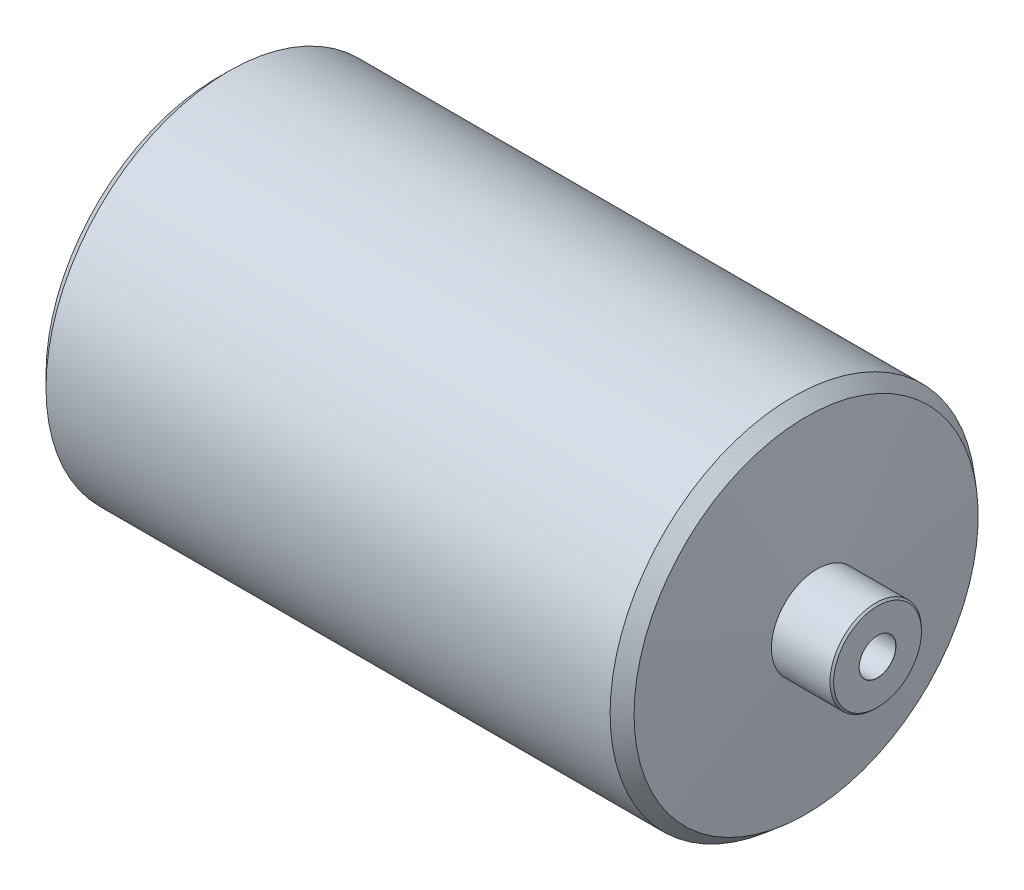
ISO-10303-21;
HEADER;
FILE_DESCRIPTION(('STEP AP214'),'2;1');
FILE_NAME('part.step','',(''),(''),'','','');
FILE_SCHEMA(('AUTOMOTIVE_DESIGN { 1 0 10303 214 1 1 1 1 }'));
ENDSEC;
DATA;
#1=APPLICATION_CONTEXT('core data for automotive mechanical design processes');
#2=APPLICATION_PROTOCOL_DEFINITION('international standard','automotive_design',2000,#1);
#3=PRODUCT_CONTEXT('',#1,'mechanical');
#4=PRODUCT('Part','Part','',(#3));
#5=PRODUCT_RELATED_PRODUCT_CATEGORY('part','',(#4));
#6=PRODUCT_DEFINITION_FORMATION('','',#4);
#7=PRODUCT_DEFINITION_CONTEXT('part definition',#1,'design');
#8=PRODUCT_DEFINITION('design','',#6,#7);
#9=PRODUCT_DEFINITION_SHAPE('','',#8);
#10=(LENGTH_UNIT() NAMED_UNIT(*) SI_UNIT(.MILLI.,.METRE.));
#11=(NAMED_UNIT(*) PLANE_ANGLE_UNIT() SI_UNIT($,.RADIAN.));
#12=(NAMED_UNIT(*) SI_UNIT($,.STERADIAN.) SOLID_ANGLE_UNIT());
#13=UNCERTAINTY_MEASURE_WITH_UNIT(LENGTH_MEASURE(1.E-05),#10,'distance_accuracy_value','');
#14=(GEOMETRIC_REPRESENTATION_CONTEXT(3) GLOBAL_UNCERTAINTY_ASSIGNED_CONTEXT((#13)) GLOBAL_UNIT_ASSIGNED_CONTEXT((#10,
#11,#12)) REPRESENTATION_CONTEXT('',''));
#15=CARTESIAN_POINT('',(0.,0.,0.));
#16=DIRECTION('',(0.,0.,1.));
#17=DIRECTION('',(1.,0.,0.));
#18=AXIS2_PLACEMENT_3D('',#15,#16,#17);
#19=CARTESIAN_POINT('',(100.,0.,0.));
#20=DIRECTION('',(-1.,0.,0.));
#21=DIRECTION('',(0.,0.,1.));
#22=AXIS2_PLACEMENT_3D('',#19,#20,#21);
#23=CYLINDRICAL_SURFACE('',#22,50.);
#24=CARTESIAN_POINT('',(-77.219175117778,0.,0.));
#25=DIRECTION('',(1.,0.,0.));
#26=DIRECTION('',(0.,0.,-1.));
#27=AXIS2_PLACEMENT_3D('',#24,#25,#26);
#28=CIRCLE('',#27,50.);
#29=CARTESIAN_POINT('',(-77.219175117778,0.,-50.));
#30=VERTEX_POINT('',#29);
#31=EDGE_CURVE('E11',#30,#30,#28,.T.);
#32=ORIENTED_EDGE('',*,*,#31,.T.);
#33=EDGE_LOOP('',(#32));
#34=FACE_BOUND('',#33,.T.);
#35=CARTESIAN_POINT('',(76.9189865148985,0.,0.));
#36=DIRECTION('',(-1.,0.,0.));
#37=DIRECTION('',(0.,0.,1.));
#38=AXIS2_PLACEMENT_3D('',#35,#36,#37);
#39=CIRCLE('',#38,50.);
#40=CARTESIAN_POINT('',(76.9189865148985,0.,50.));
#41=VERTEX_POINT('',#40);
#42=EDGE_CURVE('E103',#41,#41,#39,.T.);
#43=ORIENTED_EDGE('',*,*,#42,.T.);
#44=EDGE_LOOP('',(#43));
#45=FACE_BOUND('',#44,.T.);
#46=ADVANCED_FACE('F45',(#34,#45),#23,.T.);
#47=CARTESIAN_POINT('',(83.5,0.,0.));
#48=DIRECTION('',(1.,0.,0.));
#49=DIRECTION('',(0.,0.,-1.));
#50=AXIS2_PLACEMENT_3D('',#47,#48,#49);
#51=CYLINDRICAL_SURFACE('',#50,12.5);
#52=CARTESIAN_POINT('',(99.5,0.,0.));
#53=DIRECTION('',(1.,0.,0.));
#54=DIRECTION('',(0.,0.,-1.));
#55=AXIS2_PLACEMENT_3D('',#52,#53,#54);
#56=CIRCLE('',#55,12.5);
#57=CARTESIAN_POINT('',(99.5,0.,-12.5));
#58=VERTEX_POINT('',#57);
#59=EDGE_CURVE('E100',#58,#58,#56,.F.);
#60=ORIENTED_EDGE('',*,*,#59,.T.);
#61=EDGE_LOOP('',(#60));
#62=FACE_BOUND('',#61,.T.);
#63=CARTESIAN_POINT('',(83.5,0.,0.));
#64=DIRECTION('',(-1.,0.,0.));
#65=DIRECTION('',(0.,0.,1.));
#66=AXIS2_PLACEMENT_3D('',#63,#64,#65);
#67=CIRCLE('',#66,12.5);
#68=CARTESIAN_POINT('',(83.5,0.,12.4999999999999));
#69=VERTEX_POINT('',#68);
#70=EDGE_CURVE('E94',#69,#69,#67,.T.);
#71=ORIENTED_EDGE('',*,*,#70,.F.);
#72=EDGE_LOOP('',(#71));
#73=FACE_BOUND('',#72,.T.);
#74=ADVANCED_FACE('F131',(#62,#73),#51,.T.);
#75=CARTESIAN_POINT('',(100.,0.,0.));
#76=DIRECTION('',(1.,0.,0.));
#77=DIRECTION('',(0.,0.,-1.));
#78=AXIS2_PLACEMENT_3D('',#75,#76,#77);
#79=PLANE('',#78);
#80=CARTESIAN_POINT('',(100.,0.,0.));
#81=DIRECTION('',(1.,0.,0.));
#82=DIRECTION('',(0.,0.,-1.));
#83=AXIS2_PLACEMENT_3D('',#80,#81,#82);
#84=CIRCLE('',#83,5.025);
#85=CARTESIAN_POINT('',(100.,0.,-5.025));
#86=VERTEX_POINT('',#85);
#87=EDGE_CURVE('E73',#86,#86,#84,.T.);
#88=ORIENTED_EDGE('',*,*,#87,.F.);
#89=EDGE_LOOP('',(#88));
#90=FACE_BOUND('',#89,.T.);
#91=CARTESIAN_POINT('',(100.,0.,0.));
#92=DIRECTION('',(1.,0.,0.));
#93=DIRECTION('',(0.,0.,-1.));
#94=AXIS2_PLACEMENT_3D('',#91,#92,#93);
#95=CIRCLE('',#94,12.);
#96=CARTESIAN_POINT('',(100.,0.,-12.));
#97=VERTEX_POINT('',#96);
#98=EDGE_CURVE('E97',#97,#97,#95,.T.);
#99=ORIENTED_EDGE('',*,*,#98,.T.);
#100=EDGE_LOOP('',(#99));
#101=FACE_BOUND('',#100,.T.);
#102=ADVANCED_FACE('F139',(#90,#101),#79,.T.);
#103=CARTESIAN_POINT('',(100.,0.,0.));
#104=DIRECTION('',(-1.,0.,0.));
#105=DIRECTION('',(0.,0.,1.));
#106=AXIS2_PLACEMENT_3D('',#103,#104,#105);
#107=CONICAL_SURFACE('',#106,12.,0.785398163397424);
#108=ORIENTED_EDGE('',*,*,#59,.F.);
#109=EDGE_LOOP('',(#108));
#110=FACE_BOUND('',#109,.T.);
#111=ORIENTED_EDGE('',*,*,#98,.F.);
#112=EDGE_LOOP('',(#111));
#113=FACE_BOUND('',#112,.T.);
#114=ADVANCED_FACE('F146',(#110,#113),#107,.T.);
#115=CARTESIAN_POINT('',(83.5,0.,0.));
#116=DIRECTION('',(-1.,0.,0.));
#117=DIRECTION('',(0.,0.,1.));
#118=AXIS2_PLACEMENT_3D('',#115,#116,#117);
#119=CONICAL_SURFACE('',#118,12.5,1.48352986419518);
#120=CARTESIAN_POINT('',(80.480642346021,0.,0.));
#121=DIRECTION('',(1.,0.,0.));
#122=DIRECTION('',(0.,0.,-1.));
#123=AXIS2_PLACEMENT_3D('',#120,#121,#122);
#124=CIRCLE('',#123,47.0114159057248);
#125=CARTESIAN_POINT('',(80.480642346021,0.,47.0114159057249));
#126=VERTEX_POINT('',#125);
#127=EDGE_CURVE('E106',#126,#126,#124,.T.);
#128=CARTESIAN_POINT('',(80.480642346021,0.,47.0114159057249));
#129=CARTESIAN_POINT('',(80.5120939882499,0.,46.6519219900403));
#130=CARTESIAN_POINT('',(80.5435456304788,0.,46.2924280743557));
#131=CARTESIAN_POINT('',(80.6064489149367,0.,45.5734402429864));
#132=CARTESIAN_POINT('',(80.6379005571657,0.,45.2139463273018));
#133=CARTESIAN_POINT('',(80.7008038416236,0.,44.4949584959325));
#134=CARTESIAN_POINT('',(80.7322554838525,0.,44.1354645802479));
#135=CARTESIAN_POINT('',(80.7951587683104,0.,43.4164767488786));
#136=CARTESIAN_POINT('',(80.8266104105394,0.,43.0569828331939));
#137=CARTESIAN_POINT('',(80.8895136949973,0.,42.3379950018247));
#138=CARTESIAN_POINT('',(80.9209653372262,0.,41.97850108614));
#139=CARTESIAN_POINT('',(80.9838686216841,0.,41.2595132547708));
#140=CARTESIAN_POINT('',(81.0153202639131,0.,40.9000193390861));
#141=CARTESIAN_POINT('',(81.078223548371,0.,40.1810315077169));
#142=CARTESIAN_POINT('',(81.1096751905999,0.,39.8215375920322));
#143=CARTESIAN_POINT('',(81.1725784750578,0.,39.102549760663));
#144=CARTESIAN_POINT('',(81.2040301172868,0.,38.7430558449783));
#145=CARTESIAN_POINT('',(81.2669334017447,0.,38.0240680136091));
#146=CARTESIAN_POINT('',(81.2983850439736,0.,37.6645740979244));
#147=CARTESIAN_POINT('',(81.3612883284315,0.,36.9455862665551));
#148=CARTESIAN_POINT('',(81.3927399706604,0.,36.5860923508705));
#149=CARTESIAN_POINT('',(81.4556432551183,0.,35.8671045195012));
#150=CARTESIAN_POINT('',(81.4870948973473,0.,35.5076106038166));
#151=CARTESIAN_POINT('',(81.5499981818052,0.,34.7886227724473));
#152=CARTESIAN_POINT('',(81.5814498240342,0.,34.4291288567627));
#153=CARTESIAN_POINT('',(81.6443531084921,0.,33.7101410253934));
#154=CARTESIAN_POINT('',(81.675804750721,0.,33.3506471097088));
#155=CARTESIAN_POINT('',(81.7387080351789,0.,32.6316592783395));
#156=CARTESIAN_POINT('',(81.7701596774078,0.,32.2721653626549));
#157=CARTESIAN_POINT('',(81.8330629618657,0.,31.5531775312856));
#158=CARTESIAN_POINT('',(81.8645146040947,0.,31.193683615601));
#159=CARTESIAN_POINT('',(81.9274178885526,0.,30.4746957842317));
#160=CARTESIAN_POINT('',(81.9588695307815,0.,30.1152018685471));
#161=CARTESIAN_POINT('',(82.0217728152394,0.,29.3962140371778));
#162=CARTESIAN_POINT('',(82.0532244574684,0.,29.0367201214932));
#163=CARTESIAN_POINT('',(82.1161277419263,0.,28.3177322901239));
#164=CARTESIAN_POINT('',(82.1475793841552,0.,27.9582383744393));
#165=CARTESIAN_POINT('',(82.2104826686131,0.,27.23925054307));
#166=CARTESIAN_POINT('',(82.2419343108421,0.,26.8797566273853));
#167=CARTESIAN_POINT('',(82.3048375953,0.,26.1607687960161));
#168=CARTESIAN_POINT('',(82.3362892375289,0.,25.8012748803314));
#169=CARTESIAN_POINT('',(82.3991925219868,0.,25.0822870489622));
#170=CARTESIAN_POINT('',(82.4306441642157,0.,24.7227931332775));
#171=CARTESIAN_POINT('',(82.4935474486737,0.,24.0038053019083));
#172=CARTESIAN_POINT('',(82.5249990909026,0.,23.6443113862236));
#173=CARTESIAN_POINT('',(82.5879023753605,0.,22.9253235548544));
#174=CARTESIAN_POINT('',(82.6193540175894,0.,22.5658296391697));
#175=CARTESIAN_POINT('',(82.6822573020474,0.,21.8468418078005));
#176=CARTESIAN_POINT('',(82.7137089442763,0.,21.4873478921158));
#177=CARTESIAN_POINT('',(82.7766122287342,0.,20.7683600607465));
#178=CARTESIAN_POINT('',(82.8080638709631,0.,20.4088661450619));
#179=CARTESIAN_POINT('',(82.870967155421,0.,19.6898783136926));
#180=CARTESIAN_POINT('',(82.90241879765,0.,19.330384398008));
#181=CARTESIAN_POINT('',(82.9653220821079,0.,18.6113965666387));
#182=CARTESIAN_POINT('',(82.9967737243368,0.,18.2519026509541));
#183=CARTESIAN_POINT('',(83.0596770087947,0.,17.5329148195848));
#184=CARTESIAN_POINT('',(83.0911286510237,0.,17.1734209039002));
#185=CARTESIAN_POINT('',(83.1540319354816,0.,16.4544330725309));
#186=CARTESIAN_POINT('',(83.1854835777105,0.,16.0949391568463));
#187=CARTESIAN_POINT('',(83.2483868621684,0.,15.375951325477));
#188=CARTESIAN_POINT('',(83.2798385043974,0.,15.0164574097924));
#189=CARTESIAN_POINT('',(83.3427417888553,0.,14.2974695784231));
#190=CARTESIAN_POINT('',(83.3741934310842,0.,13.9379756627385));
#191=CARTESIAN_POINT('',(83.4370967155421,0.,13.2189878313692));
#192=CARTESIAN_POINT('',(83.4685483577711,0.,12.8594939156846));
#193=CARTESIAN_POINT('',(83.5,0.,12.4999999999999));
#194=B_SPLINE_CURVE_WITH_KNOTS('',3,(#128,#129,#130,#131,#132,#133,#134,#135,#136,#137,#138,
#139,#140,#141,#142,#143,#144,#145,#146,#147,#148,#149,#150,#151,#152,#153,#154,#155,#156,#157,
#158,#159,#160,#161,#162,#163,#164,#165,#166,#167,#168,#169,#170,#171,#172,#173,#174,#175,#176,
#177,#178,#179,#180,#181,#182,#183,#184,#185,#186,#187,#188,#189,#190,#191,#192,#193),
.UNSPECIFIED.,.F.,.F.,(4,2,2,2,2,2,2,2,2,2,2,2,2,2,2,2,2,2,2,2,2,2,2,2,2,2,2,2,2,2,2,2,4),(0.,
1.08260137212111,2.16520274424223,3.24780411636335,4.33040548848447,5.41300686060558,
6.4956082327267,7.57820960484783,8.66081097696894,9.74341234909006,10.8260137212112,
11.9086150933323,12.9912164654534,14.0738178375745,15.1564192096956,16.2390205818168,
17.3216219539379,18.404223326059,19.4868246981801,20.5694260703012,21.6520274424224,
22.7346288145435,23.8172301866646,24.8998315587857,25.9824329309068,27.0650343030279,
28.1476356751491,29.2302370472702,30.3128384193913,31.3954397915124,32.4780411636335,
33.5606425357547,34.6432439078758),.UNSPECIFIED.);
#195=EDGE_CURVE('BSEAM152',#126,#69,#194,.T.);
#196=ORIENTED_EDGE('',*,*,#127,.T.);
#197=ORIENTED_EDGE('',*,*,#70,.T.);
#198=ORIENTED_EDGE('',*,*,#195,.T.);
#199=ORIENTED_EDGE('',*,*,#195,.F.);
#200=EDGE_LOOP('',(#196,#198,#197,#199));
#201=FACE_BOUND('',#200,.T.);
#202=ADVANCED_FACE('F152',(#201),#119,.T.);
#203=CARTESIAN_POINT('',(76.9189865148985,0.,0.));
#204=DIRECTION('',(-1.,0.,0.));
#205=DIRECTION('',(0.,0.,1.));
#206=AXIS2_PLACEMENT_3D('',#203,#204,#205);
#207=CONICAL_SURFACE('',#206,50.,0.698131700797732);
#208=CARTESIAN_POINT('',(80.4806423460209,0.,47.0114159057248));
#209=CARTESIAN_POINT('',(80.4435417644467,0.,47.0425469900402));
#210=CARTESIAN_POINT('',(80.4064411828726,0.,47.0736780743555));
#211=CARTESIAN_POINT('',(80.3322400197242,0.,47.1359402429863));
#212=CARTESIAN_POINT('',(80.29513943815,0.,47.1670713273016));
#213=CARTESIAN_POINT('',(80.2209382750016,0.,47.2293334959324));
#214=CARTESIAN_POINT('',(80.1838376934274,0.,47.2604645802477));
#215=CARTESIAN_POINT('',(80.109636530279,0.,47.3227267488785));
#216=CARTESIAN_POINT('',(80.0725359487048,0.,47.3538578331938));
#217=CARTESIAN_POINT('',(79.9983347855565,0.,47.4161200018246));
#218=CARTESIAN_POINT('',(79.9612342039823,0.,47.4472510861399));
#219=CARTESIAN_POINT('',(79.8870330408339,0.,47.5095132547707));
#220=CARTESIAN_POINT('',(79.8499324592597,0.,47.540644339086));
#221=CARTESIAN_POINT('',(79.7757312961113,0.,47.6029065077168));
#222=CARTESIAN_POINT('',(79.7386307145371,0.,47.6340375920321));
#223=CARTESIAN_POINT('',(79.6644295513887,0.,47.6962997606629));
#224=CARTESIAN_POINT('',(79.6273289698145,0.,47.7274308449782));
#225=CARTESIAN_POINT('',(79.5531278066662,0.,47.789693013609));
#226=CARTESIAN_POINT('',(79.516027225092,0.,47.8208240979243));
#227=CARTESIAN_POINT('',(79.4418260619436,0.,47.8830862665551));
#228=CARTESIAN_POINT('',(79.4047254803694,0.,47.9142173508704));
#229=CARTESIAN_POINT('',(79.330524317221,0.,47.9764795195012));
#230=CARTESIAN_POINT('',(79.2934237356468,0.,48.0076106038165));
#231=CARTESIAN_POINT('',(79.2192225724984,0.,48.0698727724473));
#232=CARTESIAN_POINT('',(79.1821219909242,0.,48.1010038567626));
#233=CARTESIAN_POINT('',(79.1079208277759,0.,48.1632660253934));
#234=CARTESIAN_POINT('',(79.0708202462017,0.,48.1943971097087));
#235=CARTESIAN_POINT('',(78.9966190830533,0.,48.2566592783395));
#236=CARTESIAN_POINT('',(78.9595185014791,0.,48.2877903626548));
#237=CARTESIAN_POINT('',(78.8853173383307,0.,48.3500525312856));
#238=CARTESIAN_POINT('',(78.8482167567565,0.,48.3811836156009));
#239=CARTESIAN_POINT('',(78.7740155936081,0.,48.4434457842317));
#240=CARTESIAN_POINT('',(78.7369150120339,0.,48.474576868547));
#241=CARTESIAN_POINT('',(78.6627138488856,0.,48.5368390371778));
#242=CARTESIAN_POINT('',(78.6256132673114,0.,48.5679701214931));
#243=CARTESIAN_POINT('',(78.551412104163,0.,48.6302322901239));
#244=CARTESIAN_POINT('',(78.5143115225888,0.,48.6613633744392));
#245=CARTESIAN_POINT('',(78.4401103594404,0.,48.72362554307));
#246=CARTESIAN_POINT('',(78.4030097778662,0.,48.7547566273853));
#247=CARTESIAN_POINT('',(78.3288086147178,0.,48.8170187960161));
#248=CARTESIAN_POINT('',(78.2917080331436,0.,48.8481498803314));
#249=CARTESIAN_POINT('',(78.2175068699953,0.,48.9104120489622));
#250=CARTESIAN_POINT('',(78.1804062884211,0.,48.9415431332775));
#251=CARTESIAN_POINT('',(78.1062051252727,0.,49.0038053019083));
#252=CARTESIAN_POINT('',(78.0691045436985,0.,49.0349363862236));
#253=CARTESIAN_POINT('',(77.9949033805501,0.,49.0971985548544));
#254=CARTESIAN_POINT('',(77.9578027989759,0.,49.1283296391697));
#255=CARTESIAN_POINT('',(77.8836016358275,0.,49.1905918078005));
#256=CARTESIAN_POINT('',(77.8465010542533,0.,49.2217228921158));
#257=CARTESIAN_POINT('',(77.772299891105,0.,49.2839850607466));
#258=CARTESIAN_POINT('',(77.7351993095308,0.,49.3151161450619));
#259=CARTESIAN_POINT('',(77.6609981463824,0.,49.3773783136927));
#260=CARTESIAN_POINT('',(77.6238975648082,0.,49.408509398008));
#261=CARTESIAN_POINT('',(77.5496964016598,0.,49.4707715666388));
#262=CARTESIAN_POINT('',(77.5125958200856,0.,49.5019026509541));
#263=CARTESIAN_POINT('',(77.4383946569372,0.,49.5641648195849));
#264=CARTESIAN_POINT('',(77.401294075363,0.,49.5952959039002));
#265=CARTESIAN_POINT('',(77.3270929122147,0.,49.657558072531));
#266=CARTESIAN_POINT('',(77.2899923306405,0.,49.6886891568463));
#267=CARTESIAN_POINT('',(77.2157911674921,0.,49.7509513254771));
#268=CARTESIAN_POINT('',(77.1786905859179,0.,49.7820824097924));
#269=CARTESIAN_POINT('',(77.1044894227695,0.,49.8443445784232));
#270=CARTESIAN_POINT('',(77.0673888411953,0.,49.8754756627385));
#271=CARTESIAN_POINT('',(76.9931876780469,0.,49.9377378313693));
#272=CARTESIAN_POINT('',(76.9560870964728,0.,49.9688689156846));
#273=CARTESIAN_POINT('',(76.9189865148985,0.,50.));
#274=B_SPLINE_CURVE_WITH_KNOTS('',3,(#208,#209,#210,#211,#212,#213,#214,#215,#216,#217,#218,
#219,#220,#221,#222,#223,#224,#225,#226,#227,#228,#229,#230,#231,#232,#233,#234,#235,#236,#237,
#238,#239,#240,#241,#242,#243,#244,#245,#246,#247,#248,#249,#250,#251,#252,#253,#254,#255,#256,
#257,#258,#259,#260,#261,#262,#263,#264,#265,#266,#267,#268,#269,#270,#271,#272,#273),
.UNSPECIFIED.,.F.,.F.,(4,2,2,2,2,2,2,2,2,2,2,2,2,2,2,2,2,2,2,2,2,2,2,2,2,2,2,2,2,2,2,2,4),(0.,
0.145294108876245,0.290588217752489,0.435882326628744,0.581176435504989,0.726470544381238,
0.871764653257493,1.01705876213374,1.16235287100999,1.30764697988624,1.45294108876249,
1.59823519763874,1.74352930651499,1.88882341539123,2.03411752426749,2.17941163314373,
2.32470574201999,2.46999985089623,2.61529395977248,2.76058806864873,2.90588217752498,
3.05117628640123,3.19647039527748,3.34176450415373,3.48705861302999,3.63235272190623,
3.77764683078248,3.92294093965873,4.06823504853498,4.21352915741123,4.35882326628748,
4.50411737516372,4.64941148403998),.UNSPECIFIED.);
#275=EDGE_CURVE('BSEAM154',#126,#41,#274,.T.);
#276=ORIENTED_EDGE('',*,*,#127,.F.);
#277=ORIENTED_EDGE('',*,*,#42,.F.);
#278=ORIENTED_EDGE('',*,*,#275,.T.);
#279=ORIENTED_EDGE('',*,*,#275,.F.);
#280=EDGE_LOOP('',(#276,#278,#277,#279));
#281=FACE_BOUND('',#280,.T.);
#282=ADVANCED_FACE('F154',(#281),#207,.T.);
#283=CARTESIAN_POINT('',(43.5536576308671,0.,0.));
#284=DIRECTION('',(1.,0.,0.));
#285=DIRECTION('',(0.,0.,-1.));
#286=AXIS2_PLACEMENT_3D('',#283,#284,#285);
#287=CONICAL_SURFACE('',#286,4.24999999999999,1.02974425867665);
#288=CARTESIAN_POINT('',(41.,0.,0.));
#289=VERTEX_POINT('',#288);
#290=VERTEX_LOOP('',#289);
#291=FACE_BOUND('',#290,.T.);
#292=CARTESIAN_POINT('',(43.5536576308671,0.,0.));
#293=DIRECTION('',(1.,0.,0.));
#294=DIRECTION('',(0.,0.,-1.));
#295=AXIS2_PLACEMENT_3D('',#292,#293,#294);
#296=CIRCLE('',#295,4.24999999999999);
#297=CARTESIAN_POINT('',(43.5536576308671,0.,-4.24999999999999));
#298=VERTEX_POINT('',#297);
#299=EDGE_CURVE('E91',#298,#298,#296,.T.);
#300=ORIENTED_EDGE('',*,*,#299,.T.);
#301=EDGE_LOOP('',(#300));
#302=FACE_BOUND('',#301,.T.);
#303=ADVANCED_FACE('F159',(#291,#302),#287,.F.);
#304=CARTESIAN_POINT('',(100.,0.,0.));
#305=DIRECTION('',(1.,0.,0.));
#306=DIRECTION('',(0.,0.,-1.));
#307=AXIS2_PLACEMENT_3D('',#304,#305,#306);
#308=CYLINDRICAL_SURFACE('',#307,4.24999999999999);
#309=ORIENTED_EDGE('',*,*,#299,.F.);
#310=EDGE_LOOP('',(#309));
#311=FACE_BOUND('',#310,.T.);
#312=CARTESIAN_POINT('',(50.,0.,0.));
#313=DIRECTION('',(1.,0.,0.));
#314=DIRECTION('',(0.,0.,-1.));
#315=AXIS2_PLACEMENT_3D('',#312,#313,#314);
#316=CIRCLE('',#315,4.24999999999999);
#317=CARTESIAN_POINT('',(50.,0.,-4.24999999999999));
#318=VERTEX_POINT('',#317);
#319=EDGE_CURVE('E88',#318,#318,#316,.T.);
#320=ORIENTED_EDGE('',*,*,#319,.T.);
#321=EDGE_LOOP('',(#320));
#322=FACE_BOUND('',#321,.T.);
#323=ADVANCED_FACE('F191',(#311,#322),#308,.F.);
#324=CARTESIAN_POINT('',(50.,4.24999999999999,0.));
#325=DIRECTION('',(-1.,0.,0.));
#326=DIRECTION('',(0.,0.,1.));
#327=AXIS2_PLACEMENT_3D('',#324,#325,#326);
#328=PLANE('',#327);
#329=ORIENTED_EDGE('',*,*,#319,.F.);
#330=EDGE_LOOP('',(#329));
#331=FACE_BOUND('',#330,.T.);
#332=CARTESIAN_POINT('',(50.,0.,0.));
#333=DIRECTION('',(1.,0.,0.));
#334=DIRECTION('',(0.,0.,-1.));
#335=AXIS2_PLACEMENT_3D('',#332,#333,#334);
#336=CIRCLE('',#335,4.99999999999999);
#337=CARTESIAN_POINT('',(50.,0.,-4.99999999999999));
#338=VERTEX_POINT('',#337);
#339=EDGE_CURVE('E85',#338,#338,#336,.T.);
#340=ORIENTED_EDGE('',*,*,#339,.T.);
#341=EDGE_LOOP('',(#340));
#342=FACE_BOUND('',#341,.T.);
#343=ADVANCED_FACE('F187',(#331,#342),#328,.F.);
#344=CARTESIAN_POINT('',(100.,0.,0.));
#345=DIRECTION('',(1.,0.,0.));
#346=DIRECTION('',(0.,0.,-1.));
#347=AXIS2_PLACEMENT_3D('',#344,#345,#346);
#348=CYLINDRICAL_SURFACE('',#347,4.99999999999999);
#349=ORIENTED_EDGE('',*,*,#339,.F.);
#350=EDGE_LOOP('',(#349));
#351=FACE_BOUND('',#350,.T.);
#352=CARTESIAN_POINT('',(99.975,0.,0.));
#353=DIRECTION('',(1.,0.,0.));
#354=DIRECTION('',(0.,0.,-1.));
#355=AXIS2_PLACEMENT_3D('',#352,#353,#354);
#356=CIRCLE('',#355,4.99999999999999);
#357=CARTESIAN_POINT('',(99.975,0.,-4.99999999999999));
#358=VERTEX_POINT('',#357);
#359=EDGE_CURVE('E82',#358,#358,#356,.T.);
#360=ORIENTED_EDGE('',*,*,#359,.T.);
#361=EDGE_LOOP('',(#360));
#362=FACE_BOUND('',#361,.T.);
#363=ADVANCED_FACE('F180',(#351,#362),#348,.F.);
#364=CARTESIAN_POINT('',(100.,0.,0.));
#365=DIRECTION('',(1.,0.,0.));
#366=DIRECTION('',(0.,0.,-1.));
#367=AXIS2_PLACEMENT_3D('',#364,#365,#366);
#368=CONICAL_SURFACE('',#367,5.025,0.785398163397639);
#369=ORIENTED_EDGE('',*,*,#359,.F.);
#370=EDGE_LOOP('',(#369));
#371=FACE_BOUND('',#370,.T.);
#372=ORIENTED_EDGE('',*,*,#87,.T.);
#373=EDGE_LOOP('',(#372));
#374=FACE_BOUND('',#373,.T.);
#375=ADVANCED_FACE('F176',(#371,#374),#368,.F.);
#376=CARTESIAN_POINT('',(-83.5,0.,0.));
#377=DIRECTION('',(1.,0.,0.));
#378=DIRECTION('',(0.,0.,1.));
#379=AXIS2_PLACEMENT_3D('',#376,#377,#378);
#380=CONICAL_SURFACE('',#379,12.5,1.48352986419518);
#381=CARTESIAN_POINT('',(-80.5068055066693,0.,0.));
#382=DIRECTION('',(-1.,0.,0.));
#383=DIRECTION('',(0.,0.,1.));
#384=AXIS2_PLACEMENT_3D('',#381,#382,#383);
#385=CIRCLE('',#384,46.7123696111086);
#386=CARTESIAN_POINT('',(-80.5068055066693,0.,46.7123696111087));
#387=VERTEX_POINT('',#386);
#388=EDGE_CURVE('E54',#387,#387,#385,.T.);
#389=CARTESIAN_POINT('',(-83.5,0.,0.));
#390=DIRECTION('',(-1.,0.,0.));
#391=DIRECTION('',(0.,0.,1.));
#392=AXIS2_PLACEMENT_3D('',#389,#390,#391);
#393=CIRCLE('',#392,12.5);
#394=CARTESIAN_POINT('',(-83.5,0.,12.5000000000001));
#395=VERTEX_POINT('',#394);
#396=EDGE_CURVE('E69',#395,#395,#393,.T.);
#397=CARTESIAN_POINT('',(-80.5068055066693,0.,46.7123696111087));
#398=CARTESIAN_POINT('',(-80.5379846159748,0.,46.355990760993));
#399=CARTESIAN_POINT('',(-80.5691637252803,0.,45.9996119108773));
#400=CARTESIAN_POINT('',(-80.6315219438914,0.,45.2868542106459));
#401=CARTESIAN_POINT('',(-80.6627010531969,0.,44.9304753605302));
#402=CARTESIAN_POINT('',(-80.725059271808,0.,44.2177176602987));
#403=CARTESIAN_POINT('',(-80.7562383811135,0.,43.861338810183));
#404=CARTESIAN_POINT('',(-80.8185965997246,0.,43.1485811099516));
#405=CARTESIAN_POINT('',(-80.8497757090301,0.,42.7922022598359));
#406=CARTESIAN_POINT('',(-80.9121339276412,0.,42.0794445596044));
#407=CARTESIAN_POINT('',(-80.9433130369467,0.,41.7230657094887));
#408=CARTESIAN_POINT('',(-81.0056712555577,0.,41.0103080092573));
#409=CARTESIAN_POINT('',(-81.0368503648633,0.,40.6539291591416));
#410=CARTESIAN_POINT('',(-81.0992085834743,0.,39.9411714589101));
#411=CARTESIAN_POINT('',(-81.1303876927799,0.,39.5847926087944));
#412=CARTESIAN_POINT('',(-81.1927459113909,0.,38.872034908563));
#413=CARTESIAN_POINT('',(-81.2239250206964,0.,38.5156560584473));
#414=CARTESIAN_POINT('',(-81.2862832393075,0.,37.8028983582159));
#415=CARTESIAN_POINT('',(-81.317462348613,0.,37.4465195081001));
#416=CARTESIAN_POINT('',(-81.3798205672241,0.,36.7337618078687));
#417=CARTESIAN_POINT('',(-81.4109996765296,0.,36.377382957753));
#418=CARTESIAN_POINT('',(-81.4733578951407,0.,35.6646252575216));
#419=CARTESIAN_POINT('',(-81.5045370044462,0.,35.3082464074058));
#420=CARTESIAN_POINT('',(-81.5668952230573,0.,34.5954887071744));
#421=CARTESIAN_POINT('',(-81.5980743323628,0.,34.2391098570587));
#422=CARTESIAN_POINT('',(-81.6604325509738,0.,33.5263521568273));
#423=CARTESIAN_POINT('',(-81.6916116602794,0.,33.1699733067116));
#424=CARTESIAN_POINT('',(-81.7539698788904,0.,32.4572156064801));
#425=CARTESIAN_POINT('',(-81.7851489881959,0.,32.1008367563644));
#426=CARTESIAN_POINT('',(-81.847507206807,0.,31.388079056133));
#427=CARTESIAN_POINT('',(-81.8786863161125,0.,31.0317002060173));
#428=CARTESIAN_POINT('',(-81.9410445347236,0.,30.3189425057858));
#429=CARTESIAN_POINT('',(-81.9722236440291,0.,29.9625636556701));
#430=CARTESIAN_POINT('',(-82.0345818626402,0.,29.2498059554387));
#431=CARTESIAN_POINT('',(-82.0657609719457,0.,28.893427105323));
#432=CARTESIAN_POINT('',(-82.1281191905568,0.,28.1806694050915));
#433=CARTESIAN_POINT('',(-82.1592982998623,0.,27.8242905549758));
#434=CARTESIAN_POINT('',(-82.2216565184734,0.,27.1115328547444));
#435=CARTESIAN_POINT('',(-82.2528356277789,0.,26.7551540046287));
#436=CARTESIAN_POINT('',(-82.3151938463899,0.,26.0423963043973));
#437=CARTESIAN_POINT('',(-82.3463729556955,0.,25.6860174542815));
#438=CARTESIAN_POINT('',(-82.4087311743065,0.,24.9732597540501));
#439=CARTESIAN_POINT('',(-82.439910283612,0.,24.6168809039344));
#440=CARTESIAN_POINT('',(-82.5022685022231,0.,23.904123203703));
#441=CARTESIAN_POINT('',(-82.5334476115286,0.,23.5477443535872));
#442=CARTESIAN_POINT('',(-82.5958058301397,0.,22.8349866533558));
#443=CARTESIAN_POINT('',(-82.6269849394452,0.,22.4786078032401));
#444=CARTESIAN_POINT('',(-82.6893431580563,0.,21.7658501030087));
#445=CARTESIAN_POINT('',(-82.7205222673618,0.,21.409471252893));
#446=CARTESIAN_POINT('',(-82.7828804859729,0.,20.6967135526615));
#447=CARTESIAN_POINT('',(-82.8140595952784,0.,20.3403347025458));
#448=CARTESIAN_POINT('',(-82.8764178138894,0.,19.6275770023144));
#449=CARTESIAN_POINT('',(-82.907596923195,0.,19.2711981521987));
#450=CARTESIAN_POINT('',(-82.969955141806,0.,18.5584404519672));
#451=CARTESIAN_POINT('',(-83.0011342511116,0.,18.2020616018515));
#452=CARTESIAN_POINT('',(-83.0634924697226,0.,17.4893039016201));
#453=CARTESIAN_POINT('',(-83.0946715790281,0.,17.1329250515044));
#454=CARTESIAN_POINT('',(-83.1570297976392,0.,16.4201673512729));
#455=CARTESIAN_POINT('',(-83.1882089069447,0.,16.0637885011572));
#456=CARTESIAN_POINT('',(-83.2505671255558,0.,15.3510308009258));
#457=CARTESIAN_POINT('',(-83.2817462348613,0.,14.9946519508101));
#458=CARTESIAN_POINT('',(-83.3441044534724,0.,14.2818942505787));
#459=CARTESIAN_POINT('',(-83.3752835627779,0.,13.9255154004629));
#460=CARTESIAN_POINT('',(-83.4376417813889,0.,13.2127577002315));
#461=CARTESIAN_POINT('',(-83.4688208906945,0.,12.8563788501158));
#462=CARTESIAN_POINT('',(-83.5,0.,12.5000000000001));
#463=B_SPLINE_CURVE_WITH_KNOTS('',3,(#397,#398,#399,#400,#401,#402,#403,#404,#405,#406,#407,
#408,#409,#410,#411,#412,#413,#414,#415,#416,#417,#418,#419,#420,#421,#422,#423,#424,#425,#426,
#427,#428,#429,#430,#431,#432,#433,#434,#435,#436,#437,#438,#439,#440,#441,#442,#443,#444,#445,
#446,#447,#448,#449,#450,#451,#452,#453,#454,#455,#456,#457,#458,#459,#460,#461,#462),
.UNSPECIFIED.,.F.,.F.,(4,2,2,2,2,2,2,2,2,2,2,2,2,2,2,2,2,2,2,2,2,2,2,2,2,2,2,2,2,2,2,2,4),(0.,
1.07322047828112,2.14644095656224,3.21966143484337,4.2928819131245,5.36610239140562,
6.43932286968675,7.51254334796788,8.585763826249,9.65898430453012,10.7322047828112,
11.8054252610924,12.8786457393735,13.9518662176546,15.0250866959358,16.0983071742169,
17.171527652498,18.2447481307791,19.3179686090603,20.3911890873414,21.4644095656225,
22.5376300439036,23.6108505221848,24.6840710004659,25.757291478747,26.8305119570281,
27.9037324353093,28.9769529135904,30.0501733918715,31.1233938701526,32.1966143484338,
33.2698348267149,34.343055304996),.UNSPECIFIED.);
#464=EDGE_CURVE('BSEAM117',#387,#395,#463,.T.);
#465=ORIENTED_EDGE('',*,*,#388,.T.);
#466=ORIENTED_EDGE('',*,*,#396,.F.);
#467=ORIENTED_EDGE('',*,*,#464,.T.);
#468=ORIENTED_EDGE('',*,*,#464,.F.);
#469=EDGE_LOOP('',(#465,#467,#466,#468));
#470=FACE_BOUND('',#469,.T.);
#471=ADVANCED_FACE('F117',(#470),#380,.T.);
#472=CARTESIAN_POINT('',(-100.,0.,0.));
#473=DIRECTION('',(-1.,0.,0.));
#474=DIRECTION('',(0.,0.,-1.));
#475=AXIS2_PLACEMENT_3D('',#472,#473,#474);
#476=PLANE('',#475);
#477=CARTESIAN_POINT('',(-100.,0.,0.));
#478=DIRECTION('',(-1.,0.,0.));
#479=DIRECTION('',(0.,0.,1.));
#480=AXIS2_PLACEMENT_3D('',#477,#478,#479);
#481=CIRCLE('',#480,5.025);
#482=CARTESIAN_POINT('',(-100.,0.,5.025));
#483=VERTEX_POINT('',#482);
#484=EDGE_CURVE('E335',#483,#483,#481,.T.);
#485=ORIENTED_EDGE('',*,*,#484,.F.);
#486=EDGE_LOOP('',(#485));
#487=FACE_BOUND('',#486,.T.);
#488=CARTESIAN_POINT('',(-100.,0.,0.));
#489=DIRECTION('',(-1.,0.,0.));
#490=DIRECTION('',(0.,0.,1.));
#491=AXIS2_PLACEMENT_3D('',#488,#489,#490);
#492=CIRCLE('',#491,12.);
#493=CARTESIAN_POINT('',(-100.,0.,12.));
#494=VERTEX_POINT('',#493);
#495=EDGE_CURVE('E112',#494,#494,#492,.T.);
#496=ORIENTED_EDGE('',*,*,#495,.T.);
#497=EDGE_LOOP('',(#496));
#498=FACE_BOUND('',#497,.T.);
#499=ADVANCED_FACE('F164',(#487,#498),#476,.T.);
#500=CARTESIAN_POINT('',(-99.5,0.,0.));
#501=DIRECTION('',(1.,0.,0.));
#502=DIRECTION('',(0.,0.,-1.));
#503=AXIS2_PLACEMENT_3D('',#500,#501,#502);
#504=CONICAL_SURFACE('',#503,12.5,0.785398163397438);
#505=ORIENTED_EDGE('',*,*,#495,.F.);
#506=EDGE_LOOP('',(#505));
#507=FACE_BOUND('',#506,.T.);
#508=CARTESIAN_POINT('',(-99.5,0.,0.));
#509=DIRECTION('',(-1.,0.,0.));
#510=DIRECTION('',(0.,0.,1.));
#511=AXIS2_PLACEMENT_3D('',#508,#509,#510);
#512=CIRCLE('',#511,12.5);
#513=CARTESIAN_POINT('',(-99.5,0.,12.5));
#514=VERTEX_POINT('',#513);
#515=EDGE_CURVE('E109',#514,#514,#512,.F.);
#516=ORIENTED_EDGE('',*,*,#515,.F.);
#517=EDGE_LOOP('',(#516));
#518=FACE_BOUND('',#517,.T.);
#519=ADVANCED_FACE('F126',(#507,#518),#504,.T.);
#520=CARTESIAN_POINT('',(-83.5,0.,0.));
#521=DIRECTION('',(-1.,0.,0.));
#522=DIRECTION('',(0.,0.,1.));
#523=AXIS2_PLACEMENT_3D('',#520,#521,#522);
#524=CYLINDRICAL_SURFACE('',#523,12.5);
#525=ORIENTED_EDGE('',*,*,#515,.T.);
#526=EDGE_LOOP('',(#525));
#527=FACE_BOUND('',#526,.T.);
#528=ORIENTED_EDGE('',*,*,#396,.T.);
#529=EDGE_LOOP('',(#528));
#530=FACE_BOUND('',#529,.T.);
#531=ADVANCED_FACE('F121',(#527,#530),#524,.T.);
#532=CARTESIAN_POINT('',(-80.5068055066693,0.,0.));
#533=DIRECTION('',(1.,0.,0.));
#534=DIRECTION('',(0.,0.,-1.));
#535=AXIS2_PLACEMENT_3D('',#532,#533,#534);
#536=CONICAL_SURFACE('',#535,46.7123696111086,0.785398163397452);
#537=ORIENTED_EDGE('',*,*,#31,.F.);
#538=EDGE_LOOP('',(#537));
#539=FACE_BOUND('',#538,.T.);
#540=ORIENTED_EDGE('',*,*,#388,.F.);
#541=EDGE_LOOP('',(#540));
#542=FACE_BOUND('',#541,.T.);
#543=ADVANCED_FACE('F48',(#539,#542),#536,.T.);
#544=CARTESIAN_POINT('',(-43.5536576308671,0.,0.));
#545=DIRECTION('',(-1.,0.,0.));
#546=DIRECTION('',(0.,0.,1.));
#547=AXIS2_PLACEMENT_3D('',#544,#545,#546);
#548=CONICAL_SURFACE('',#547,4.24999999999999,1.02974425867665);
#549=CARTESIAN_POINT('',(-41.,0.,0.));
#550=VERTEX_POINT('',#549);
#551=VERTEX_LOOP('',#550);
#552=FACE_BOUND('',#551,.T.);
#553=CARTESIAN_POINT('',(-43.5536576308671,0.,0.));
#554=DIRECTION('',(-1.,0.,0.));
#555=DIRECTION('',(0.,0.,1.));
#556=AXIS2_PLACEMENT_3D('',#553,#554,#555);
#557=CIRCLE('',#556,4.24999999999999);
#558=CARTESIAN_POINT('',(-43.5536576308671,0.,4.24999999999999));
#559=VERTEX_POINT('',#558);
#560=EDGE_CURVE('E67',#559,#559,#557,.T.);
#561=ORIENTED_EDGE('',*,*,#560,.T.);
#562=EDGE_LOOP('',(#561));
#563=FACE_BOUND('',#562,.T.);
#564=ADVANCED_FACE('F60',(#552,#563),#548,.F.);
#565=CARTESIAN_POINT('',(-100.,0.,0.));
#566=DIRECTION('',(-1.,0.,0.));
#567=DIRECTION('',(0.,0.,1.));
#568=AXIS2_PLACEMENT_3D('',#565,#566,#567);
#569=CYLINDRICAL_SURFACE('',#568,4.24999999999999);
#570=ORIENTED_EDGE('',*,*,#560,.F.);
#571=EDGE_LOOP('',(#570));
#572=FACE_BOUND('',#571,.T.);
#573=CARTESIAN_POINT('',(-50.,0.,0.));
#574=DIRECTION('',(-1.,0.,0.));
#575=DIRECTION('',(0.,0.,1.));
#576=AXIS2_PLACEMENT_3D('',#573,#574,#575);
#577=CIRCLE('',#576,4.24999999999999);
#578=CARTESIAN_POINT('',(-50.,0.,4.24999999999999));
#579=VERTEX_POINT('',#578);
#580=EDGE_CURVE('E70',#579,#579,#577,.T.);
#581=ORIENTED_EDGE('',*,*,#580,.T.);
#582=EDGE_LOOP('',(#581));
#583=FACE_BOUND('',#582,.T.);
#584=ADVANCED_FACE('F63',(#572,#583),#569,.F.);
#585=CARTESIAN_POINT('',(-50.,4.24999999999999,0.));
#586=DIRECTION('',(1.,0.,0.));
#587=DIRECTION('',(0.,0.,-1.));
#588=AXIS2_PLACEMENT_3D('',#585,#586,#587);
#589=PLANE('',#588);
#590=ORIENTED_EDGE('',*,*,#580,.F.);
#591=EDGE_LOOP('',(#590));
#592=FACE_BOUND('',#591,.T.);
#593=CARTESIAN_POINT('',(-50.,0.,0.));
#594=DIRECTION('',(-1.,0.,0.));
#595=DIRECTION('',(0.,0.,1.));
#596=AXIS2_PLACEMENT_3D('',#593,#594,#595);
#597=CIRCLE('',#596,4.99999999999999);
#598=CARTESIAN_POINT('',(-50.,0.,4.99999999999999));
#599=VERTEX_POINT('',#598);
#600=EDGE_CURVE('E76',#599,#599,#597,.T.);
#601=ORIENTED_EDGE('',*,*,#600,.T.);
#602=EDGE_LOOP('',(#601));
#603=FACE_BOUND('',#602,.T.);
#604=ADVANCED_FACE('F297',(#592,#603),#589,.F.);
#605=CARTESIAN_POINT('',(-100.,0.,0.));
#606=DIRECTION('',(-1.,0.,0.));
#607=DIRECTION('',(0.,0.,1.));
#608=AXIS2_PLACEMENT_3D('',#605,#606,#607);
#609=CYLINDRICAL_SURFACE('',#608,4.99999999999999);
#610=ORIENTED_EDGE('',*,*,#600,.F.);
#611=EDGE_LOOP('',(#610));
#612=FACE_BOUND('',#611,.T.);
#613=CARTESIAN_POINT('',(-99.975,0.,0.));
#614=DIRECTION('',(-1.,0.,0.));
#615=DIRECTION('',(0.,0.,1.));
#616=AXIS2_PLACEMENT_3D('',#613,#614,#615);
#617=CIRCLE('',#616,4.99999999999999);
#618=CARTESIAN_POINT('',(-99.975,0.,4.99999999999999));
#619=VERTEX_POINT('',#618);
#620=EDGE_CURVE('E332',#619,#619,#617,.T.);
#621=ORIENTED_EDGE('',*,*,#620,.T.);
#622=EDGE_LOOP('',(#621));
#623=FACE_BOUND('',#622,.T.);
#624=ADVANCED_FACE('F305',(#612,#623),#609,.F.);
#625=CARTESIAN_POINT('',(-100.,0.,0.));
#626=DIRECTION('',(-1.,0.,0.));
#627=DIRECTION('',(0.,0.,1.));
#628=AXIS2_PLACEMENT_3D('',#625,#626,#627);
#629=CONICAL_SURFACE('',#628,5.025,0.785398163397639);
#630=ORIENTED_EDGE('',*,*,#620,.F.);
#631=EDGE_LOOP('',(#630));
#632=FACE_BOUND('',#631,.T.);
#633=ORIENTED_EDGE('',*,*,#484,.T.);
#634=EDGE_LOOP('',(#633));
#635=FACE_BOUND('',#634,.T.);
#636=ADVANCED_FACE('F316',(#632,#635),#629,.F.);
#637=CLOSED_SHELL('',(#46,#74,#102,#114,#202,#282,#303,#323,#343,#363,#375,#471,#499,#519,#531,
#543,#564,#584,#604,#624,#636));
#638=MANIFOLD_SOLID_BREP('B2',#637);
#639=ADVANCED_BREP_SHAPE_REPRESENTATION('',(#18,#638),#14);
#640=SHAPE_DEFINITION_REPRESENTATION(#9,#639);
ENDSEC;
END-ISO-10303-21;
